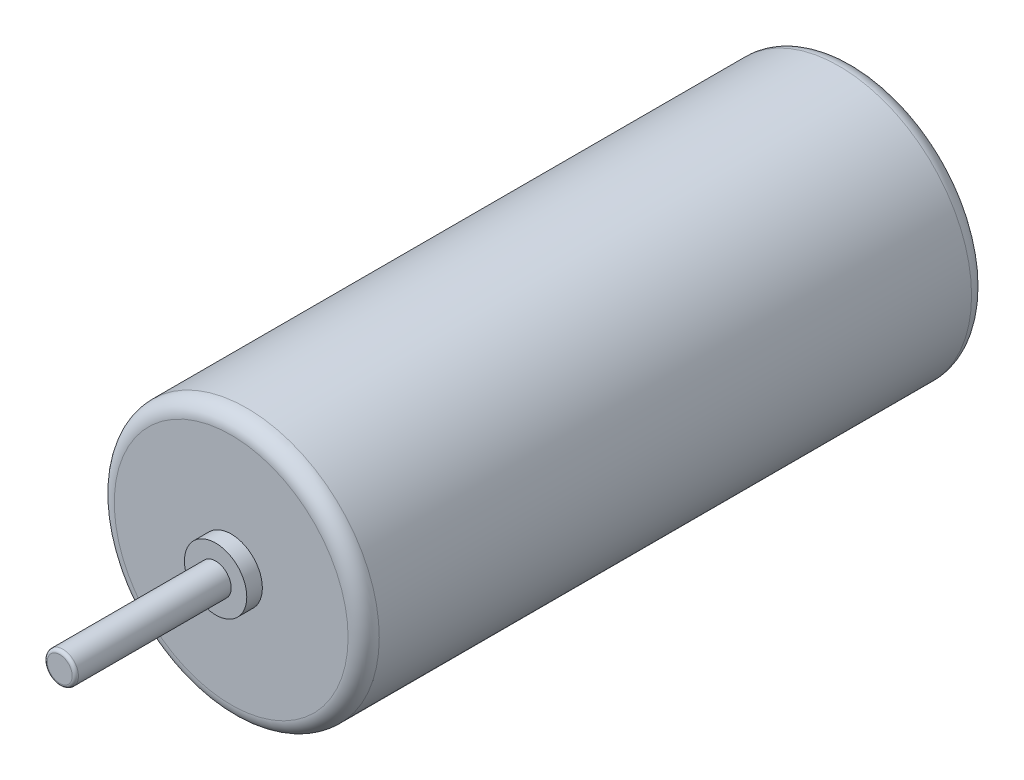
ISO-10303-21;
HEADER;
FILE_DESCRIPTION(('STEP AP214'),'2;1');
FILE_NAME('part.step','',(''),(''),'','','');
FILE_SCHEMA(('AUTOMOTIVE_DESIGN { 1 0 10303 214 1 1 1 1 }'));
ENDSEC;
DATA;
#1=APPLICATION_CONTEXT('core data for automotive mechanical design processes');
#2=APPLICATION_PROTOCOL_DEFINITION('international standard','automotive_design',2000,#1);
#3=PRODUCT_CONTEXT('',#1,'mechanical');
#4=PRODUCT('Part','Part','',(#3));
#5=PRODUCT_RELATED_PRODUCT_CATEGORY('part','',(#4));
#6=PRODUCT_DEFINITION_FORMATION('','',#4);
#7=PRODUCT_DEFINITION_CONTEXT('part definition',#1,'design');
#8=PRODUCT_DEFINITION('design','',#6,#7);
#9=PRODUCT_DEFINITION_SHAPE('','',#8);
#10=(LENGTH_UNIT() NAMED_UNIT(*) SI_UNIT(.MILLI.,.METRE.));
#11=(NAMED_UNIT(*) PLANE_ANGLE_UNIT() SI_UNIT($,.RADIAN.));
#12=(NAMED_UNIT(*) SI_UNIT($,.STERADIAN.) SOLID_ANGLE_UNIT());
#13=UNCERTAINTY_MEASURE_WITH_UNIT(LENGTH_MEASURE(1.E-05),#10,'distance_accuracy_value','');
#14=(GEOMETRIC_REPRESENTATION_CONTEXT(3) GLOBAL_UNCERTAINTY_ASSIGNED_CONTEXT((#13)) GLOBAL_UNIT_ASSIGNED_CONTEXT((#10,
#11,#12)) REPRESENTATION_CONTEXT('',''));
#15=CARTESIAN_POINT('',(0.,0.,0.));
#16=DIRECTION('',(0.,0.,1.));
#17=DIRECTION('',(1.,0.,0.));
#18=AXIS2_PLACEMENT_3D('',#15,#16,#17);
#19=CARTESIAN_POINT('',(0.,0.,20.));
#20=DIRECTION('',(0.,0.,-1.));
#21=DIRECTION('',(-1.,0.,0.));
#22=AXIS2_PLACEMENT_3D('',#19,#20,#21);
#23=CYLINDRICAL_SURFACE('',#22,4.25);
#24=CARTESIAN_POINT('',(0.,0.,0.5));
#25=DIRECTION('',(0.,0.,1.));
#26=DIRECTION('',(1.,0.,0.));
#27=AXIS2_PLACEMENT_3D('',#24,#25,#26);
#28=CIRCLE('',#27,4.25);
#29=CARTESIAN_POINT('',(4.25,0.,0.5));
#30=VERTEX_POINT('',#29);
#31=EDGE_CURVE('E46',#30,#30,#28,.T.);
#32=ORIENTED_EDGE('',*,*,#31,.T.);
#33=EDGE_LOOP('',(#32));
#34=FACE_BOUND('',#33,.T.);
#35=CARTESIAN_POINT('',(0.,0.,19.5));
#36=DIRECTION('',(0.,0.,1.));
#37=DIRECTION('',(1.,0.,0.));
#38=AXIS2_PLACEMENT_3D('',#35,#36,#37);
#39=CIRCLE('',#38,4.25);
#40=CARTESIAN_POINT('',(4.25,0.,19.5));
#41=VERTEX_POINT('',#40);
#42=EDGE_CURVE('E59',#41,#41,#39,.F.);
#43=ORIENTED_EDGE('',*,*,#42,.T.);
#44=EDGE_LOOP('',(#43));
#45=FACE_BOUND('',#44,.T.);
#46=ADVANCED_FACE('F39',(#34,#45),#23,.T.);
#47=CARTESIAN_POINT('',(0.,0.,20.));
#48=DIRECTION('',(0.,0.,1.));
#49=DIRECTION('',(1.,0.,0.));
#50=AXIS2_PLACEMENT_3D('',#47,#48,#49);
#51=PLANE('',#50);
#52=CARTESIAN_POINT('',(0.,0.,20.));
#53=DIRECTION('',(0.,0.,1.));
#54=DIRECTION('',(1.,0.,0.));
#55=AXIS2_PLACEMENT_3D('',#52,#53,#54);
#56=CIRCLE('',#55,3.75);
#57=CARTESIAN_POINT('',(3.75,0.,20.));
#58=VERTEX_POINT('',#57);
#59=EDGE_CURVE('E62',#58,#58,#56,.T.);
#60=ORIENTED_EDGE('',*,*,#59,.T.);
#61=EDGE_LOOP('',(#60));
#62=FACE_BOUND('',#61,.T.);
#63=CARTESIAN_POINT('',(0.,0.,20.));
#64=DIRECTION('',(0.,0.,1.));
#65=DIRECTION('',(1.,0.,0.));
#66=AXIS2_PLACEMENT_3D('',#63,#64,#65);
#67=CIRCLE('',#66,1.);
#68=CARTESIAN_POINT('',(1.,0.,20.));
#69=VERTEX_POINT('',#68);
#70=EDGE_CURVE('E66',#69,#69,#67,.T.);
#71=ORIENTED_EDGE('',*,*,#70,.F.);
#72=EDGE_LOOP('',(#71));
#73=FACE_BOUND('',#72,.T.);
#74=ADVANCED_FACE('F90',(#62,#73),#51,.T.);
#75=CARTESIAN_POINT('',(0.,0.,0.));
#76=DIRECTION('',(0.,0.,1.));
#77=DIRECTION('',(1.,0.,0.));
#78=AXIS2_PLACEMENT_3D('',#75,#76,#77);
#79=PLANE('',#78);
#80=CARTESIAN_POINT('',(0.,0.,0.));
#81=DIRECTION('',(0.,0.,1.));
#82=DIRECTION('',(1.,0.,0.));
#83=AXIS2_PLACEMENT_3D('',#80,#81,#82);
#84=CIRCLE('',#83,3.75);
#85=CARTESIAN_POINT('',(3.75,0.,0.));
#86=VERTEX_POINT('',#85);
#87=EDGE_CURVE('E10',#86,#86,#84,.F.);
#88=ORIENTED_EDGE('',*,*,#87,.T.);
#89=EDGE_LOOP('',(#88));
#90=FACE_BOUND('',#89,.T.);
#91=ADVANCED_FACE('F86',(#90),#79,.F.);
#92=CARTESIAN_POINT('',(0.,0.,20.5));
#93=DIRECTION('',(0.,0.,-1.));
#94=DIRECTION('',(-1.,0.,0.));
#95=AXIS2_PLACEMENT_3D('',#92,#93,#94);
#96=CYLINDRICAL_SURFACE('',#95,1.);
#97=CARTESIAN_POINT('',(0.,0.,20.5));
#98=DIRECTION('',(0.,0.,1.));
#99=DIRECTION('',(1.,0.,0.));
#100=AXIS2_PLACEMENT_3D('',#97,#98,#99);
#101=CIRCLE('',#100,1.);
#102=CARTESIAN_POINT('',(1.,0.,20.5));
#103=VERTEX_POINT('',#102);
#104=EDGE_CURVE('E69',#103,#103,#101,.T.);
#105=ORIENTED_EDGE('',*,*,#104,.F.);
#106=EDGE_LOOP('',(#105));
#107=FACE_BOUND('',#106,.T.);
#108=ORIENTED_EDGE('',*,*,#70,.T.);
#109=EDGE_LOOP('',(#108));
#110=FACE_BOUND('',#109,.T.);
#111=ADVANCED_FACE('F80',(#107,#110),#96,.T.);
#112=CARTESIAN_POINT('',(0.,0.,20.5));
#113=DIRECTION('',(0.,0.,1.));
#114=DIRECTION('',(1.,0.,0.));
#115=AXIS2_PLACEMENT_3D('',#112,#113,#114);
#116=PLANE('',#115);
#117=CARTESIAN_POINT('',(0.,0.,20.5));
#118=DIRECTION('',(0.,0.,1.));
#119=DIRECTION('',(1.,0.,0.));
#120=AXIS2_PLACEMENT_3D('',#117,#118,#119);
#121=CIRCLE('',#120,0.5);
#122=CARTESIAN_POINT('',(0.5,0.,20.5));
#123=VERTEX_POINT('',#122);
#124=EDGE_CURVE('E65',#123,#123,#121,.T.);
#125=ORIENTED_EDGE('',*,*,#124,.F.);
#126=EDGE_LOOP('',(#125));
#127=FACE_BOUND('',#126,.T.);
#128=ORIENTED_EDGE('',*,*,#104,.T.);
#129=EDGE_LOOP('',(#128));
#130=FACE_BOUND('',#129,.T.);
#131=ADVANCED_FACE('F77',(#127,#130),#116,.T.);
#132=CARTESIAN_POINT('',(0.,0.,25.5));
#133=DIRECTION('',(0.,0.,-1.));
#134=DIRECTION('',(-1.,0.,0.));
#135=AXIS2_PLACEMENT_3D('',#132,#133,#134);
#136=CYLINDRICAL_SURFACE('',#135,0.5);
#137=CARTESIAN_POINT('',(0.,0.,25.4));
#138=DIRECTION('',(0.,0.,1.));
#139=DIRECTION('',(1.,0.,0.));
#140=AXIS2_PLACEMENT_3D('',#137,#138,#139);
#141=CIRCLE('',#140,0.5);
#142=CARTESIAN_POINT('',(0.5,0.,25.4));
#143=VERTEX_POINT('',#142);
#144=EDGE_CURVE('E50',#143,#143,#141,.F.);
#145=ORIENTED_EDGE('',*,*,#144,.T.);
#146=EDGE_LOOP('',(#145));
#147=FACE_BOUND('',#146,.T.);
#148=ORIENTED_EDGE('',*,*,#124,.T.);
#149=EDGE_LOOP('',(#148));
#150=FACE_BOUND('',#149,.T.);
#151=ADVANCED_FACE('F75',(#147,#150),#136,.T.);
#152=CARTESIAN_POINT('',(0.,0.,25.5));
#153=DIRECTION('',(0.,0.,1.));
#154=DIRECTION('',(1.,0.,0.));
#155=AXIS2_PLACEMENT_3D('',#152,#153,#154);
#156=PLANE('',#155);
#157=CARTESIAN_POINT('',(0.,0.,25.5));
#158=DIRECTION('',(0.,0.,1.));
#159=DIRECTION('',(1.,0.,0.));
#160=AXIS2_PLACEMENT_3D('',#157,#158,#159);
#161=CIRCLE('',#160,0.4);
#162=CARTESIAN_POINT('',(0.4,0.,25.5));
#163=VERTEX_POINT('',#162);
#164=EDGE_CURVE('E54',#163,#163,#161,.T.);
#165=ORIENTED_EDGE('',*,*,#164,.T.);
#166=EDGE_LOOP('',(#165));
#167=FACE_BOUND('',#166,.T.);
#168=ADVANCED_FACE('F104',(#167),#156,.T.);
#169=CARTESIAN_POINT('',(0.,0.,19.5));
#170=DIRECTION('',(0.,0.,1.));
#171=DIRECTION('',(1.,0.,0.));
#172=AXIS2_PLACEMENT_3D('',#169,#170,#171);
#173=TOROIDAL_SURFACE('',#172,3.75,0.5);
#174=ORIENTED_EDGE('',*,*,#42,.F.);
#175=EDGE_LOOP('',(#174));
#176=FACE_BOUND('',#175,.T.);
#177=ORIENTED_EDGE('',*,*,#59,.F.);
#178=EDGE_LOOP('',(#177));
#179=FACE_BOUND('',#178,.T.);
#180=ADVANCED_FACE('F102',(#176,#179),#173,.T.);
#181=CARTESIAN_POINT('',(0.,0.,25.4));
#182=DIRECTION('',(0.,0.,1.));
#183=DIRECTION('',(1.,0.,0.));
#184=AXIS2_PLACEMENT_3D('',#181,#182,#183);
#185=TOROIDAL_SURFACE('',#184,0.4,0.1);
#186=ORIENTED_EDGE('',*,*,#144,.F.);
#187=EDGE_LOOP('',(#186));
#188=FACE_BOUND('',#187,.T.);
#189=ORIENTED_EDGE('',*,*,#164,.F.);
#190=EDGE_LOOP('',(#189));
#191=FACE_BOUND('',#190,.T.);
#192=ADVANCED_FACE('F103',(#188,#191),#185,.T.);
#193=CARTESIAN_POINT('',(0.,0.,0.5));
#194=DIRECTION('',(0.,0.,1.));
#195=DIRECTION('',(1.,0.,0.));
#196=AXIS2_PLACEMENT_3D('',#193,#194,#195);
#197=TOROIDAL_SURFACE('',#196,3.75,0.5);
#198=ORIENTED_EDGE('',*,*,#87,.F.);
#199=EDGE_LOOP('',(#198));
#200=FACE_BOUND('',#199,.T.);
#201=ORIENTED_EDGE('',*,*,#31,.F.);
#202=EDGE_LOOP('',(#201));
#203=FACE_BOUND('',#202,.T.);
#204=ADVANCED_FACE('F41',(#200,#203),#197,.T.);
#205=CLOSED_SHELL('',(#46,#74,#91,#111,#131,#151,#168,#180,#192,#204));
#206=MANIFOLD_SOLID_BREP('B2',#205);
#207=ADVANCED_BREP_SHAPE_REPRESENTATION('',(#18,#206),#14);
#208=SHAPE_DEFINITION_REPRESENTATION(#9,#207);
ENDSEC;
END-ISO-10303-21;
